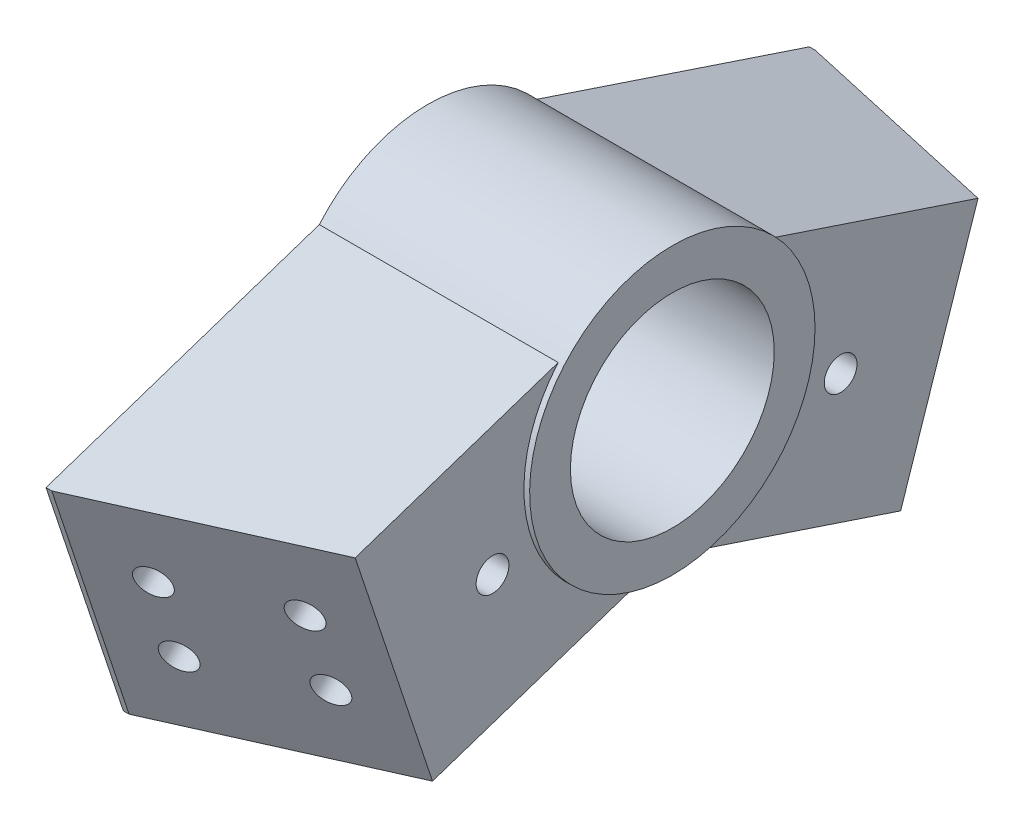
ISO-10303-21;
HEADER;
FILE_DESCRIPTION(('STEP AP214'),'2;1');
FILE_NAME('part.step','',(''),(''),'','','');
FILE_SCHEMA(('AUTOMOTIVE_DESIGN { 1 0 10303 214 1 1 1 1 }'));
ENDSEC;
DATA;
#1=APPLICATION_CONTEXT('core data for automotive mechanical design processes');
#2=APPLICATION_PROTOCOL_DEFINITION('international standard','automotive_design',2000,#1);
#3=PRODUCT_CONTEXT('',#1,'mechanical');
#4=PRODUCT('Part','Part','',(#3));
#5=PRODUCT_RELATED_PRODUCT_CATEGORY('part','',(#4));
#6=PRODUCT_DEFINITION_FORMATION('','',#4);
#7=PRODUCT_DEFINITION_CONTEXT('part definition',#1,'design');
#8=PRODUCT_DEFINITION('design','',#6,#7);
#9=PRODUCT_DEFINITION_SHAPE('','',#8);
#10=(LENGTH_UNIT() NAMED_UNIT(*) SI_UNIT(.MILLI.,.METRE.));
#11=(NAMED_UNIT(*) PLANE_ANGLE_UNIT() SI_UNIT($,.RADIAN.));
#12=(NAMED_UNIT(*) SI_UNIT($,.STERADIAN.) SOLID_ANGLE_UNIT());
#13=UNCERTAINTY_MEASURE_WITH_UNIT(LENGTH_MEASURE(1.E-05),#10,'distance_accuracy_value','');
#14=(GEOMETRIC_REPRESENTATION_CONTEXT(3) GLOBAL_UNCERTAINTY_ASSIGNED_CONTEXT((#13)) GLOBAL_UNIT_ASSIGNED_CONTEXT((#10,
#11,#12)) REPRESENTATION_CONTEXT('',''));
#15=CARTESIAN_POINT('',(0.,0.,0.));
#16=DIRECTION('',(0.,0.,1.));
#17=DIRECTION('',(1.,0.,0.));
#18=AXIS2_PLACEMENT_3D('',#15,#16,#17);
#19=CARTESIAN_POINT('',(101.6,-76.2,-228.6));
#20=DIRECTION('',(-1.,0.,0.));
#21=DIRECTION('',(0.,0.,1.));
#22=AXIS2_PLACEMENT_3D('',#19,#20,#21);
#23=CYLINDRICAL_SURFACE('',#22,22.225);
#24=CARTESIAN_POINT('',(101.6,-76.2,-228.6));
#25=DIRECTION('',(1.,0.,0.));
#26=DIRECTION('',(0.,0.,-1.));
#27=AXIS2_PLACEMENT_3D('',#24,#25,#26);
#28=CIRCLE('',#27,22.225);
#29=CARTESIAN_POINT('',(101.6,-76.2,-250.825));
#30=VERTEX_POINT('',#29);
#31=EDGE_CURVE('E11',#30,#30,#28,.T.);
#32=ORIENTED_EDGE('',*,*,#31,.F.);
#33=EDGE_LOOP('',(#32));
#34=FACE_BOUND('',#33,.T.);
#35=DIRECTION('',(-1.,0.,0.));
#36=VECTOR('',#35,1.);
#37=CARTESIAN_POINT('',(101.6,-61.7476401468381,-245.484309866699));
#38=LINE('',#37,#36);
#39=CARTESIAN_POINT('',(63.5,-61.7476401468266,-245.484309866712));
#40=VERTEX_POINT('',#39);
#41=CARTESIAN_POINT('',(100.70528765619,-61.747640146848,-245.484309866754));
#42=VERTEX_POINT('',#41);
#43=EDGE_CURVE('E171',#40,#42,#38,.F.);
#44=ORIENTED_EDGE('',*,*,#43,.F.);
#45=CARTESIAN_POINT('',(63.5,-76.2,-228.6));
#46=DIRECTION('',(1.,0.,0.));
#47=DIRECTION('',(0.,0.,-1.));
#48=AXIS2_PLACEMENT_3D('',#45,#46,#47);
#49=CIRCLE('',#48,22.225);
#50=CARTESIAN_POINT('',(63.5,-61.7476401469432,-211.715690133211));
#51=VERTEX_POINT('',#50);
#52=EDGE_CURVE('E54',#40,#51,#49,.T.);
#53=ORIENTED_EDGE('',*,*,#52,.T.);
#54=DIRECTION('',(-1.,0.,0.));
#55=VECTOR('',#54,1.);
#56=CARTESIAN_POINT('',(101.6,-61.74764014688,-211.715690133265));
#57=LINE('',#56,#55);
#58=CARTESIAN_POINT('',(100.70528765619,-61.74764014688,-211.715690133265));
#59=VERTEX_POINT('',#58);
#60=EDGE_CURVE('E213',#51,#59,#57,.F.);
#61=ORIENTED_EDGE('',*,*,#60,.T.);
#62=CARTESIAN_POINT('',(100.70528765619,-76.2,-228.6));
#63=DIRECTION('',(-1.,0.,0.));
#64=DIRECTION('',(0.,0.,1.));
#65=AXIS2_PLACEMENT_3D('',#62,#63,#64);
#66=CIRCLE('',#65,22.225);
#67=CARTESIAN_POINT('',(100.70528765619,-97.8924738025491,-223.763968018538));
#68=VERTEX_POINT('',#67);
#69=EDGE_CURVE('E212',#59,#68,#66,.F.);
#70=ORIENTED_EDGE('',*,*,#69,.T.);
#71=DIRECTION('',(-1.,0.,0.));
#72=VECTOR('',#71,1.);
#73=CARTESIAN_POINT('',(101.6,-97.8924738025491,-223.763968018538));
#74=LINE('',#73,#72);
#75=CARTESIAN_POINT('',(63.5,-97.8924738025491,-223.763968018538));
#76=VERTEX_POINT('',#75);
#77=EDGE_CURVE('E47',#68,#76,#74,.T.);
#78=ORIENTED_EDGE('',*,*,#77,.T.);
#79=CARTESIAN_POINT('',(63.5,-97.8924738025568,-233.436031981508));
#80=VERTEX_POINT('',#79);
#81=EDGE_CURVE('E36',#76,#80,#49,.T.);
#82=ORIENTED_EDGE('',*,*,#81,.T.);
#83=DIRECTION('',(-1.,0.,0.));
#84=VECTOR('',#83,1.);
#85=CARTESIAN_POINT('',(101.6,-97.8924738025491,-233.436031981462));
#86=LINE('',#85,#84);
#87=CARTESIAN_POINT('',(100.70528765619,-97.8924738025491,-233.436031981462));
#88=VERTEX_POINT('',#87);
#89=EDGE_CURVE('E167',#88,#80,#86,.T.);
#90=ORIENTED_EDGE('',*,*,#89,.F.);
#91=CARTESIAN_POINT('',(100.70528765619,-76.2,-228.6));
#92=DIRECTION('',(1.,0.,0.));
#93=DIRECTION('',(0.,0.,-1.));
#94=AXIS2_PLACEMENT_3D('',#91,#92,#93);
#95=CIRCLE('',#94,22.225);
#96=EDGE_CURVE('E168',#42,#88,#95,.F.);
#97=ORIENTED_EDGE('',*,*,#96,.F.);
#98=EDGE_LOOP('',(#44,#53,#61,#70,#78,#82,#90,#97));
#99=FACE_BOUND('',#98,.T.);
#100=ADVANCED_FACE('F33',(#34,#99),#23,.T.);
#101=CARTESIAN_POINT('',(101.6,-76.2,-228.6));
#102=DIRECTION('',(1.,0.,0.));
#103=DIRECTION('',(0.,0.,-1.));
#104=AXIS2_PLACEMENT_3D('',#101,#102,#103);
#105=PLANE('',#104);
#106=CARTESIAN_POINT('',(101.6,-76.2,-228.6));
#107=DIRECTION('',(1.,0.,0.));
#108=DIRECTION('',(0.,0.,-1.));
#109=AXIS2_PLACEMENT_3D('',#106,#107,#108);
#110=CIRCLE('',#109,15.875);
#111=CARTESIAN_POINT('',(101.6,-76.2,-244.475));
#112=VERTEX_POINT('',#111);
#113=EDGE_CURVE('E246',#112,#112,#110,.T.);
#114=ORIENTED_EDGE('',*,*,#113,.F.);
#115=EDGE_LOOP('',(#114));
#116=FACE_BOUND('',#115,.T.);
#117=ORIENTED_EDGE('',*,*,#31,.T.);
#118=EDGE_LOOP('',(#117));
#119=FACE_BOUND('',#118,.T.);
#120=ADVANCED_FACE('F312',(#116,#119),#105,.T.);
#121=CARTESIAN_POINT('',(63.5,-76.2,-228.6));
#122=DIRECTION('',(1.,0.,0.));
#123=DIRECTION('',(0.,0.,-1.));
#124=AXIS2_PLACEMENT_3D('',#121,#122,#123);
#125=PLANE('',#124);
#126=CARTESIAN_POINT('',(63.4999999999997,-85.2362084139313,-255.708625241793));
#127=DIRECTION('',(-1.,0.,0.));
#128=DIRECTION('',(0.,0.,1.));
#129=AXIS2_PLACEMENT_3D('',#126,#127,#128);
#130=CIRCLE('',#129,2.55269999999999);
#131=CARTESIAN_POINT('',(63.4999999999997,-85.2362084139313,-253.155925241793));
#132=VERTEX_POINT('',#131);
#133=EDGE_CURVE('E303',#132,#132,#130,.T.);
#134=ORIENTED_EDGE('',*,*,#133,.F.);
#135=EDGE_LOOP('',(#134));
#136=FACE_BOUND('',#135,.T.);
#137=CARTESIAN_POINT('',(63.4999999999997,-85.2362084139314,-201.491374758207));
#138=DIRECTION('',(-1.,0.,0.));
#139=DIRECTION('',(0.,0.,1.));
#140=AXIS2_PLACEMENT_3D('',#137,#138,#139);
#141=CIRCLE('',#140,2.55269999999999);
#142=CARTESIAN_POINT('',(63.4999999999997,-85.2362084139314,-198.938674758207));
#143=VERTEX_POINT('',#142);
#144=EDGE_CURVE('E297',#143,#143,#141,.T.);
#145=ORIENTED_EDGE('',*,*,#144,.F.);
#146=EDGE_LOOP('',(#145));
#147=FACE_BOUND('',#146,.T.);
#148=CARTESIAN_POINT('',(63.5,-76.2,-228.6));
#149=DIRECTION('',(1.,0.,0.));
#150=DIRECTION('',(0.,0.,-1.));
#151=AXIS2_PLACEMENT_3D('',#148,#149,#150);
#152=CIRCLE('',#151,15.875);
#153=CARTESIAN_POINT('',(63.5,-76.2,-244.475));
#154=VERTEX_POINT('',#153);
#155=EDGE_CURVE('E254',#154,#154,#152,.T.);
#156=ORIENTED_EDGE('',*,*,#155,.T.);
#157=EDGE_LOOP('',(#156));
#158=FACE_BOUND('',#157,.T.);
#159=ORIENTED_EDGE('',*,*,#81,.F.);
#160=DIRECTION('',(0.,0.316227766016993,-0.948683298050462));
#161=VECTOR('',#160,1.);
#162=CARTESIAN_POINT('',(63.5,-97.8924738025491,-223.763968018538));
#163=LINE('',#162,#161);
#164=CARTESIAN_POINT('',(63.5,-112.08120913018,-181.197762035668));
#165=VERTEX_POINT('',#164);
#166=EDGE_CURVE('E225',#165,#76,#163,.T.);
#167=ORIENTED_EDGE('',*,*,#166,.F.);
#168=DIRECTION('',(0.,-0.948683298050514,-0.316227766016838));
#169=VECTOR('',#168,1.);
#170=CARTESIAN_POINT('',(63.5,-112.08120913018,-181.197762035668));
#171=LINE('',#170,#169);
#172=CARTESIAN_POINT('',(63.5,-75.9363754744556,-169.149484150427));
#173=VERTEX_POINT('',#172);
#174=EDGE_CURVE('E240',#173,#165,#171,.T.);
#175=ORIENTED_EDGE('',*,*,#174,.F.);
#176=DIRECTION('',(0.,-0.316227766017049,0.948683298050444));
#177=VECTOR('',#176,1.);
#178=CARTESIAN_POINT('',(63.5,-75.9363754744557,-169.149484150426));
#179=LINE('',#178,#177);
#180=EDGE_CURVE('E236',#51,#173,#179,.T.);
#181=ORIENTED_EDGE('',*,*,#180,.F.);
#182=ORIENTED_EDGE('',*,*,#52,.F.);
#183=DIRECTION('',(0.,0.316227766016693,0.948683298050562));
#184=VECTOR('',#183,1.);
#185=CARTESIAN_POINT('',(63.5,-61.7476401468381,-245.484309866699));
#186=LINE('',#185,#184);
#187=CARTESIAN_POINT('',(63.5,-75.9363754744556,-288.050515849574));
#188=VERTEX_POINT('',#187);
#189=EDGE_CURVE('E250',#188,#40,#186,.T.);
#190=ORIENTED_EDGE('',*,*,#189,.F.);
#191=DIRECTION('',(0.,0.948683298050514,-0.316227766016838));
#192=VECTOR('',#191,1.);
#193=CARTESIAN_POINT('',(63.5,-75.9363754744557,-288.050515849574));
#194=LINE('',#193,#192);
#195=CARTESIAN_POINT('',(63.5,-112.08120913018,-276.002237964332));
#196=VERTEX_POINT('',#195);
#197=EDGE_CURVE('E139',#196,#188,#194,.T.);
#198=ORIENTED_EDGE('',*,*,#197,.F.);
#199=DIRECTION('',(0.,-0.31622776601683,-0.948683298050517));
#200=VECTOR('',#199,1.);
#201=CARTESIAN_POINT('',(63.5,-112.08120913018,-276.002237964332));
#202=LINE('',#201,#200);
#203=EDGE_CURVE('E291',#80,#196,#202,.T.);
#204=ORIENTED_EDGE('',*,*,#203,.F.);
#205=EDGE_LOOP('',(#159,#167,#175,#181,#182,#190,#198,#204));
#206=FACE_BOUND('',#205,.T.);
#207=ADVANCED_FACE('F309',(#136,#147,#158,#206),#125,.F.);
#208=CARTESIAN_POINT('',(100.705287655612,166534.347129812,-500000.));
#209=DIRECTION('',(-1.,0.,0.));
#210=DIRECTION('',(0.,0.,1.));
#211=AXIS2_PLACEMENT_3D('',#208,#209,#210);
#212=PLANE('',#211);
#213=CARTESIAN_POINT('',(100.70528765619,-85.2362084139314,-201.491374758207));
#214=DIRECTION('',(-1.,0.,0.));
#215=DIRECTION('',(0.,0.,1.));
#216=AXIS2_PLACEMENT_3D('',#213,#214,#215);
#217=CIRCLE('',#216,2.55269999999999);
#218=CARTESIAN_POINT('',(100.70528765619,-85.2362084139314,-198.938674758207));
#219=VERTEX_POINT('',#218);
#220=EDGE_CURVE('E144',#219,#219,#217,.T.);
#221=ORIENTED_EDGE('',*,*,#220,.T.);
#222=EDGE_LOOP('',(#221));
#223=FACE_BOUND('',#222,.T.);
#224=ORIENTED_EDGE('',*,*,#69,.F.);
#225=DIRECTION('',(0.,-0.316227766016844,0.948683298050512));
#226=VECTOR('',#225,1.);
#227=CARTESIAN_POINT('',(100.705287655612,166534.347129812,-500000.));
#228=LINE('',#227,#226);
#229=CARTESIAN_POINT('',(100.70528765619,-72.2873739605623,-180.096488692107));
#230=VERTEX_POINT('',#229);
#231=EDGE_CURVE('E201',#59,#230,#228,.T.);
#232=ORIENTED_EDGE('',*,*,#231,.T.);
#233=DIRECTION('',(0.,-0.948683298050514,-0.316227766016838));
#234=VECTOR('',#233,1.);
#235=CARTESIAN_POINT('',(100.70528765619,-72.2873739605623,-180.096488692107));
#236=LINE('',#235,#234);
#237=CARTESIAN_POINT('',(100.70528765619,-108.432207616287,-192.144766577348));
#238=VERTEX_POINT('',#237);
#239=EDGE_CURVE('E197',#230,#238,#236,.T.);
#240=ORIENTED_EDGE('',*,*,#239,.T.);
#241=DIRECTION('',(0.,-0.316227766016844,0.948683298050512));
#242=VECTOR('',#241,1.);
#243=CARTESIAN_POINT('',(100.705287655612,166498.202296156,-500012.048277885));
#244=LINE('',#243,#242);
#245=EDGE_CURVE('E210',#68,#238,#244,.T.);
#246=ORIENTED_EDGE('',*,*,#245,.F.);
#247=EDGE_LOOP('',(#224,#232,#240,#246));
#248=FACE_BOUND('',#247,.T.);
#249=ADVANCED_FACE('F226',(#223,#248),#212,.F.);
#250=CARTESIAN_POINT('',(64.3947123432313,166494.553294643,-500001.101273344));
#251=DIRECTION('',(0.,0.948683298050512,0.316227766016844));
#252=DIRECTION('',(0.,-0.316227766016844,0.948683298050512));
#253=AXIS2_PLACEMENT_3D('',#250,#251,#252);
#254=PLANE('',#253);
#255=ORIENTED_EDGE('',*,*,#77,.F.);
#256=ORIENTED_EDGE('',*,*,#245,.T.);
#257=DIRECTION('',(-0.953033472765887,-0.0957743179499562,0.28732295384987));
#258=VECTOR('',#257,1.);
#259=CARTESIAN_POINT('',(64.3947123438099,-112.08120913018,-181.197762035668));
#260=LINE('',#259,#258);
#261=CARTESIAN_POINT('',(64.3947123438099,-112.08120913018,-181.197762035668));
#262=VERTEX_POINT('',#261);
#263=EDGE_CURVE('E205',#238,#262,#260,.T.);
#264=ORIENTED_EDGE('',*,*,#263,.T.);
#265=DIRECTION('',(1.,0.,0.));
#266=VECTOR('',#265,1.);
#267=CARTESIAN_POINT('',(-10.7711923613539,-112.08120913018,-181.197762035668));
#268=LINE('',#267,#266);
#269=EDGE_CURVE('E233',#165,#262,#268,.T.);
#270=ORIENTED_EDGE('',*,*,#269,.F.);
#271=ORIENTED_EDGE('',*,*,#166,.T.);
#272=EDGE_LOOP('',(#255,#256,#264,#270,#271));
#273=FACE_BOUND('',#272,.T.);
#274=ADVANCED_FACE('F222',(#273),#254,.F.);
#275=CARTESIAN_POINT('',(64.3947123432313,166530.698128298,-499989.052995458));
#276=DIRECTION('',(0.,-0.948683298050512,-0.316227766016844));
#277=DIRECTION('',(0.,0.316227766016844,-0.948683298050512));
#278=AXIS2_PLACEMENT_3D('',#275,#276,#277);
#279=PLANE('',#278);
#280=ORIENTED_EDGE('',*,*,#60,.F.);
#281=ORIENTED_EDGE('',*,*,#180,.T.);
#282=DIRECTION('',(1.,0.,0.));
#283=VECTOR('',#282,1.);
#284=CARTESIAN_POINT('',(-10.7711923613539,-75.9363754744557,-169.149484150426));
#285=LINE('',#284,#283);
#286=CARTESIAN_POINT('',(64.3947123438099,-75.9363754744556,-169.149484150427));
#287=VERTEX_POINT('',#286);
#288=EDGE_CURVE('E237',#173,#287,#285,.T.);
#289=ORIENTED_EDGE('',*,*,#288,.T.);
#290=DIRECTION('',(0.953033472765887,0.0957743179499562,-0.28732295384987));
#291=VECTOR('',#290,1.);
#292=CARTESIAN_POINT('',(64.3947123438099,-75.9363754744556,-169.149484150427));
#293=LINE('',#292,#291);
#294=EDGE_CURVE('E198',#287,#230,#293,.T.);
#295=ORIENTED_EDGE('',*,*,#294,.T.);
#296=ORIENTED_EDGE('',*,*,#231,.F.);
#297=EDGE_LOOP('',(#280,#281,#289,#295,#296));
#298=FACE_BOUND('',#297,.T.);
#299=ADVANCED_FACE('F317',(#298),#279,.F.);
#300=CARTESIAN_POINT('',(-33.4800061517165,33.3153680589672,-99.9461041769018));
#301=DIRECTION('',(0.302864986071011,-0.301375646032025,0.904126938096076));
#302=DIRECTION('',(0.948213667692879,0.,-0.31763318529464));
#303=AXIS2_PLACEMENT_3D('',#300,#301,#302);
#304=PLANE('',#303);
#305=CARTESIAN_POINT('',(91.6276438280951,-85.2479022242772,-181.3758301851));
#306=DIRECTION('',(0.302864986071011,-0.301375646032025,0.904126938096076));
#307=DIRECTION('',(0.948213667692879,0.,-0.31763318529464));
#308=AXIS2_PLACEMENT_3D('',#305,#306,#307);
#309=CIRCLE('',#308,2.55269999999998);
#310=CARTESIAN_POINT('',(94.0481488576147,-85.2479022242772,-182.186652417202));
#311=VERTEX_POINT('',#310);
#312=EDGE_CURVE('E176',#311,#311,#309,.T.);
#313=ORIENTED_EDGE('',*,*,#312,.F.);
#314=EDGE_LOOP('',(#313));
#315=FACE_BOUND('',#314,.T.);
#316=CARTESIAN_POINT('',(91.6276438280951,-97.2961801095187,-185.391922813514));
#317=DIRECTION('',(0.302864986071011,-0.301375646032025,0.904126938096076));
#318=DIRECTION('',(0.948213667692879,0.,-0.31763318529464));
#319=AXIS2_PLACEMENT_3D('',#316,#317,#318);
#320=CIRCLE('',#319,2.55269999999998);
#321=CARTESIAN_POINT('',(94.0481488576147,-97.2961801095187,-186.202745045616));
#322=VERTEX_POINT('',#321);
#323=EDGE_CURVE('E182',#322,#322,#320,.T.);
#324=ORIENTED_EDGE('',*,*,#323,.F.);
#325=EDGE_LOOP('',(#324));
#326=FACE_BOUND('',#325,.T.);
#327=CARTESIAN_POINT('',(73.472356171905,-87.0724029812239,-175.90232791426));
#328=DIRECTION('',(0.302864986071011,-0.301375646032025,0.904126938096076));
#329=DIRECTION('',(0.948213667692879,0.,-0.31763318529464));
#330=AXIS2_PLACEMENT_3D('',#327,#328,#329);
#331=CIRCLE('',#330,2.55269999999998);
#332=CARTESIAN_POINT('',(75.8928612014246,-87.0724029812239,-176.713150146362));
#333=VERTEX_POINT('',#332);
#334=EDGE_CURVE('E188',#333,#333,#331,.T.);
#335=ORIENTED_EDGE('',*,*,#334,.F.);
#336=EDGE_LOOP('',(#335));
#337=FACE_BOUND('',#336,.T.);
#338=CARTESIAN_POINT('',(73.472356171905,-99.1206808664654,-179.918420542674));
#339=DIRECTION('',(0.302864986071011,-0.301375646032025,0.904126938096076));
#340=DIRECTION('',(0.948213667692879,0.,-0.31763318529464));
#341=AXIS2_PLACEMENT_3D('',#338,#339,#340);
#342=CIRCLE('',#341,2.55269999999998);
#343=CARTESIAN_POINT('',(75.8928612014246,-99.1206808664654,-180.729242774776));
#344=VERTEX_POINT('',#343);
#345=EDGE_CURVE('E194',#344,#344,#342,.T.);
#346=ORIENTED_EDGE('',*,*,#345,.F.);
#347=EDGE_LOOP('',(#346));
#348=FACE_BOUND('',#347,.T.);
#349=ORIENTED_EDGE('',*,*,#239,.F.);
#350=ORIENTED_EDGE('',*,*,#294,.F.);
#351=DIRECTION('',(0.,0.948683298050514,0.316227766016838));
#352=VECTOR('',#351,1.);
#353=CARTESIAN_POINT('',(64.3947123438099,-75.9363754744556,-169.149484150427));
#354=LINE('',#353,#352);
#355=EDGE_CURVE('E202',#262,#287,#354,.T.);
#356=ORIENTED_EDGE('',*,*,#355,.F.);
#357=ORIENTED_EDGE('',*,*,#263,.F.);
#358=EDGE_LOOP('',(#349,#350,#356,#357));
#359=FACE_BOUND('',#358,.T.);
#360=ADVANCED_FACE('F229',(#315,#326,#337,#348,#359),#304,.T.);
#361=CARTESIAN_POINT('',(73.472356171905,-99.1206808664654,-179.918420542674));
#362=DIRECTION('',(0.302864986071011,-0.301375646032025,0.904126938096076));
#363=DIRECTION('',(0.948213667692879,0.,-0.31763318529464));
#364=AXIS2_PLACEMENT_3D('',#361,#362,#363);
#365=CYLINDRICAL_SURFACE('',#364,2.55269999999999);
#366=CARTESIAN_POINT('',(70.3952479134236,-96.05870430278,-189.10435023373));
#367=DIRECTION('',(0.302864986071011,-0.301375646032025,0.904126938096076));
#368=DIRECTION('',(0.948213667692879,0.,-0.31763318529464));
#369=AXIS2_PLACEMENT_3D('',#366,#367,#368);
#370=CIRCLE('',#369,2.55269999999999);
#371=CARTESIAN_POINT('',(72.8157529429432,-96.05870430278,-189.915172465832));
#372=VERTEX_POINT('',#371);
#373=EDGE_CURVE('E191',#372,#372,#370,.T.);
#374=ORIENTED_EDGE('',*,*,#373,.F.);
#375=EDGE_LOOP('',(#374));
#376=FACE_BOUND('',#375,.T.);
#377=ORIENTED_EDGE('',*,*,#345,.T.);
#378=EDGE_LOOP('',(#377));
#379=FACE_BOUND('',#378,.T.);
#380=ADVANCED_FACE('F324',(#376,#379),#365,.F.);
#381=CARTESIAN_POINT('',(70.3952479134236,-96.05870430278,-189.10435023373));
#382=DIRECTION('',(0.302864986071011,-0.301375646032025,0.904126938096076));
#383=DIRECTION('',(0.948213667692879,0.,-0.31763318529464));
#384=AXIS2_PLACEMENT_3D('',#381,#382,#383);
#385=CONICAL_SURFACE('',#384,2.55269999999999,1.02974425867665);
#386=CARTESIAN_POINT('',(69.9307084787058,-95.5964492429872,-190.491115413109));
#387=VERTEX_POINT('',#386);
#388=VERTEX_LOOP('',#387);
#389=FACE_BOUND('',#388,.T.);
#390=ORIENTED_EDGE('',*,*,#373,.T.);
#391=EDGE_LOOP('',(#390));
#392=FACE_BOUND('',#391,.T.);
#393=ADVANCED_FACE('F346',(#389,#392),#385,.F.);
#394=CARTESIAN_POINT('',(73.472356171905,-87.0724029812239,-175.90232791426));
#395=DIRECTION('',(0.302864986071011,-0.301375646032025,0.904126938096076));
#396=DIRECTION('',(0.948213667692879,0.,-0.31763318529464));
#397=AXIS2_PLACEMENT_3D('',#394,#395,#396);
#398=CYLINDRICAL_SURFACE('',#397,2.55269999999999);
#399=CARTESIAN_POINT('',(70.3952479134236,-84.0104264175385,-185.088257605316));
#400=DIRECTION('',(0.302864986071011,-0.301375646032025,0.904126938096076));
#401=DIRECTION('',(0.948213667692879,0.,-0.31763318529464));
#402=AXIS2_PLACEMENT_3D('',#399,#400,#401);
#403=CIRCLE('',#402,2.55269999999999);
#404=CARTESIAN_POINT('',(72.8157529429432,-84.0104264175385,-185.899079837418));
#405=VERTEX_POINT('',#404);
#406=EDGE_CURVE('E185',#405,#405,#403,.T.);
#407=ORIENTED_EDGE('',*,*,#406,.F.);
#408=EDGE_LOOP('',(#407));
#409=FACE_BOUND('',#408,.T.);
#410=ORIENTED_EDGE('',*,*,#334,.T.);
#411=EDGE_LOOP('',(#410));
#412=FACE_BOUND('',#411,.T.);
#413=ADVANCED_FACE('F352',(#409,#412),#398,.F.);
#414=CARTESIAN_POINT('',(70.3952479134236,-84.0104264175385,-185.088257605316));
#415=DIRECTION('',(0.302864986071011,-0.301375646032025,0.904126938096076));
#416=DIRECTION('',(0.948213667692879,0.,-0.31763318529464));
#417=AXIS2_PLACEMENT_3D('',#414,#415,#416);
#418=CONICAL_SURFACE('',#417,2.55269999999999,1.02974425867665);
#419=CARTESIAN_POINT('',(69.9307084787058,-83.5481713577457,-186.475022784695));
#420=VERTEX_POINT('',#419);
#421=VERTEX_LOOP('',#420);
#422=FACE_BOUND('',#421,.T.);
#423=ORIENTED_EDGE('',*,*,#406,.T.);
#424=EDGE_LOOP('',(#423));
#425=FACE_BOUND('',#424,.T.);
#426=ADVANCED_FACE('F360',(#422,#425),#418,.F.);
#427=CARTESIAN_POINT('',(91.6276438280951,-97.2961801095187,-185.391922813514));
#428=DIRECTION('',(0.302864986071011,-0.301375646032025,0.904126938096076));
#429=DIRECTION('',(0.948213667692879,0.,-0.31763318529464));
#430=AXIS2_PLACEMENT_3D('',#427,#428,#429);
#431=CYLINDRICAL_SURFACE('',#430,2.55269999999999);
#432=CARTESIAN_POINT('',(88.5505355696137,-94.2342035458334,-194.57785250457));
#433=DIRECTION('',(0.302864986071011,-0.301375646032025,0.904126938096076));
#434=DIRECTION('',(0.948213667692879,0.,-0.31763318529464));
#435=AXIS2_PLACEMENT_3D('',#432,#433,#434);
#436=CIRCLE('',#435,2.55269999999999);
#437=CARTESIAN_POINT('',(90.9710405991333,-94.2342035458334,-195.388674736672));
#438=VERTEX_POINT('',#437);
#439=EDGE_CURVE('E179',#438,#438,#436,.T.);
#440=ORIENTED_EDGE('',*,*,#439,.F.);
#441=EDGE_LOOP('',(#440));
#442=FACE_BOUND('',#441,.T.);
#443=ORIENTED_EDGE('',*,*,#323,.T.);
#444=EDGE_LOOP('',(#443));
#445=FACE_BOUND('',#444,.T.);
#446=ADVANCED_FACE('F364',(#442,#445),#431,.F.);
#447=CARTESIAN_POINT('',(88.5505355696137,-94.2342035458334,-194.57785250457));
#448=DIRECTION('',(0.302864986071011,-0.301375646032025,0.904126938096076));
#449=DIRECTION('',(0.948213667692879,0.,-0.31763318529464));
#450=AXIS2_PLACEMENT_3D('',#447,#448,#449);
#451=CONICAL_SURFACE('',#450,2.55269999999999,1.02974425867665);
#452=CARTESIAN_POINT('',(88.0859961348959,-93.7719484860405,-195.964617683949));
#453=VERTEX_POINT('',#452);
#454=VERTEX_LOOP('',#453);
#455=FACE_BOUND('',#454,.T.);
#456=ORIENTED_EDGE('',*,*,#439,.T.);
#457=EDGE_LOOP('',(#456));
#458=FACE_BOUND('',#457,.T.);
#459=ADVANCED_FACE('F368',(#455,#458),#451,.F.);
#460=CARTESIAN_POINT('',(91.6276438280951,-85.2479022242772,-181.3758301851));
#461=DIRECTION('',(0.302864986071011,-0.301375646032025,0.904126938096076));
#462=DIRECTION('',(0.948213667692879,0.,-0.31763318529464));
#463=AXIS2_PLACEMENT_3D('',#460,#461,#462);
#464=CYLINDRICAL_SURFACE('',#463,2.55269999999999);
#465=CARTESIAN_POINT('',(88.5505355696137,-82.1859256605918,-190.561759876157));
#466=DIRECTION('',(0.302864986071011,-0.301375646032025,0.904126938096076));
#467=DIRECTION('',(0.948213667692879,0.,-0.31763318529464));
#468=AXIS2_PLACEMENT_3D('',#465,#466,#467);
#469=CIRCLE('',#468,2.55269999999999);
#470=CARTESIAN_POINT('',(90.9710405991333,-82.1859256605918,-191.372582108258));
#471=VERTEX_POINT('',#470);
#472=EDGE_CURVE('E173',#471,#471,#469,.T.);
#473=ORIENTED_EDGE('',*,*,#472,.F.);
#474=EDGE_LOOP('',(#473));
#475=FACE_BOUND('',#474,.T.);
#476=ORIENTED_EDGE('',*,*,#312,.T.);
#477=EDGE_LOOP('',(#476));
#478=FACE_BOUND('',#477,.T.);
#479=ADVANCED_FACE('F372',(#475,#478),#464,.F.);
#480=CARTESIAN_POINT('',(88.5505355696137,-82.1859256605918,-190.561759876157));
#481=DIRECTION('',(0.302864986071011,-0.301375646032025,0.904126938096076));
#482=DIRECTION('',(0.948213667692879,0.,-0.31763318529464));
#483=AXIS2_PLACEMENT_3D('',#480,#481,#482);
#484=CONICAL_SURFACE('',#483,2.55269999999999,1.02974425867665);
#485=CARTESIAN_POINT('',(88.0859961348959,-81.723670600799,-191.948525055535));
#486=VERTEX_POINT('',#485);
#487=VERTEX_LOOP('',#486);
#488=FACE_BOUND('',#487,.T.);
#489=ORIENTED_EDGE('',*,*,#472,.T.);
#490=EDGE_LOOP('',(#489));
#491=FACE_BOUND('',#490,.T.);
#492=ADVANCED_FACE('F376',(#488,#491),#484,.F.);
#493=CARTESIAN_POINT('',(64.3947123432308,166683.098128298,499989.052995458));
#494=DIRECTION('',(0.,0.948683298050512,-0.316227766016844));
#495=DIRECTION('',(0.,0.316227766016844,0.948683298050512));
#496=AXIS2_PLACEMENT_3D('',#493,#494,#495);
#497=PLANE('',#496);
#498=DIRECTION('',(0.953033472765887,0.0957743179499562,0.28732295384987));
#499=VECTOR('',#498,1.);
#500=CARTESIAN_POINT('',(64.3947123438099,-75.9363754744556,-288.050515849574));
#501=LINE('',#500,#499);
#502=CARTESIAN_POINT('',(64.3947123438098,-75.9363754744556,-288.050515849574));
#503=VERTEX_POINT('',#502);
#504=CARTESIAN_POINT('',(100.70528765619,-72.2873739605623,-277.103511307893));
#505=VERTEX_POINT('',#504);
#506=EDGE_CURVE('E151',#503,#505,#501,.T.);
#507=ORIENTED_EDGE('',*,*,#506,.F.);
#508=DIRECTION('',(1.,0.,0.));
#509=VECTOR('',#508,1.);
#510=CARTESIAN_POINT('',(-10.771192361354,-75.9363754744557,-288.050515849573));
#511=LINE('',#510,#509);
#512=EDGE_CURVE('E133',#188,#503,#511,.T.);
#513=ORIENTED_EDGE('',*,*,#512,.F.);
#514=ORIENTED_EDGE('',*,*,#189,.T.);
#515=ORIENTED_EDGE('',*,*,#43,.T.);
#516=DIRECTION('',(0.,-0.316227766016844,-0.948683298050512));
#517=VECTOR('',#516,1.);
#518=CARTESIAN_POINT('',(100.705287655611,166686.747129812,500000.));
#519=LINE('',#518,#517);
#520=EDGE_CURVE('E157',#42,#505,#519,.T.);
#521=ORIENTED_EDGE('',*,*,#520,.T.);
#522=EDGE_LOOP('',(#507,#513,#514,#515,#521));
#523=FACE_BOUND('',#522,.T.);
#524=ADVANCED_FACE('F155',(#523),#497,.T.);
#525=CARTESIAN_POINT('',(-33.4800061517165,33.3153680589672,-357.253895823098));
#526=DIRECTION('',(0.302864986071011,-0.301375646032025,-0.904126938096076));
#527=DIRECTION('',(0.948213667692879,0.,0.31763318529464));
#528=AXIS2_PLACEMENT_3D('',#525,#526,#527);
#529=PLANE('',#528);
#530=CARTESIAN_POINT('',(91.6276438280951,-85.2479022242772,-275.8241698149));
#531=DIRECTION('',(0.302864986071011,-0.301375646032025,-0.904126938096076));
#532=DIRECTION('',(-0.948213667692879,0.,-0.31763318529464));
#533=AXIS2_PLACEMENT_3D('',#530,#531,#532);
#534=CIRCLE('',#533,2.55269999999998);
#535=CARTESIAN_POINT('',(89.2071387985755,-85.2479022242772,-276.634992047001));
#536=VERTEX_POINT('',#535);
#537=EDGE_CURVE('E257',#536,#536,#534,.T.);
#538=ORIENTED_EDGE('',*,*,#537,.F.);
#539=EDGE_LOOP('',(#538));
#540=FACE_BOUND('',#539,.T.);
#541=CARTESIAN_POINT('',(91.6276438280951,-97.2961801095187,-271.808077186486));
#542=DIRECTION('',(0.302864986071011,-0.301375646032025,-0.904126938096076));
#543=DIRECTION('',(-0.948213667692879,0.,-0.31763318529464));
#544=AXIS2_PLACEMENT_3D('',#541,#542,#543);
#545=CIRCLE('',#544,2.55269999999998);
#546=CARTESIAN_POINT('',(89.2071387985755,-97.2961801095187,-272.618899418587));
#547=VERTEX_POINT('',#546);
#548=EDGE_CURVE('E265',#547,#547,#545,.T.);
#549=ORIENTED_EDGE('',*,*,#548,.F.);
#550=EDGE_LOOP('',(#549));
#551=FACE_BOUND('',#550,.T.);
#552=CARTESIAN_POINT('',(73.472356171905,-87.0724029812239,-281.29767208574));
#553=DIRECTION('',(0.302864986071011,-0.301375646032025,-0.904126938096076));
#554=DIRECTION('',(-0.948213667692879,0.,-0.31763318529464));
#555=AXIS2_PLACEMENT_3D('',#552,#553,#554);
#556=CIRCLE('',#555,2.55269999999998);
#557=CARTESIAN_POINT('',(71.0518511423854,-87.0724029812239,-282.108494317841));
#558=VERTEX_POINT('',#557);
#559=EDGE_CURVE('E271',#558,#558,#556,.T.);
#560=ORIENTED_EDGE('',*,*,#559,.F.);
#561=EDGE_LOOP('',(#560));
#562=FACE_BOUND('',#561,.T.);
#563=CARTESIAN_POINT('',(73.472356171905,-99.1206808664654,-277.281579457326));
#564=DIRECTION('',(0.302864986071011,-0.301375646032025,-0.904126938096076));
#565=DIRECTION('',(-0.948213667692879,0.,-0.31763318529464));
#566=AXIS2_PLACEMENT_3D('',#563,#564,#565);
#567=CIRCLE('',#566,2.55269999999998);
#568=CARTESIAN_POINT('',(71.0518511423854,-99.1206808664654,-278.092401689427));
#569=VERTEX_POINT('',#568);
#570=EDGE_CURVE('E277',#569,#569,#567,.T.);
#571=ORIENTED_EDGE('',*,*,#570,.F.);
#572=EDGE_LOOP('',(#571));
#573=FACE_BOUND('',#572,.T.);
#574=DIRECTION('',(0.,-0.948683298050514,0.316227766016838));
#575=VECTOR('',#574,1.);
#576=CARTESIAN_POINT('',(100.70528765619,-72.2873739605623,-277.103511307893));
#577=LINE('',#576,#575);
#578=CARTESIAN_POINT('',(100.70528765619,-108.432207616287,-265.055233422652));
#579=VERTEX_POINT('',#578);
#580=EDGE_CURVE('E163',#505,#579,#577,.T.);
#581=ORIENTED_EDGE('',*,*,#580,.T.);
#582=DIRECTION('',(-0.953033472765887,-0.0957743179499562,-0.28732295384987));
#583=VECTOR('',#582,1.);
#584=CARTESIAN_POINT('',(64.3947123438099,-112.08120913018,-276.002237964332));
#585=LINE('',#584,#583);
#586=CARTESIAN_POINT('',(64.3947123438099,-112.08120913018,-276.002237964332));
#587=VERTEX_POINT('',#586);
#588=EDGE_CURVE('E153',#579,#587,#585,.T.);
#589=ORIENTED_EDGE('',*,*,#588,.T.);
#590=DIRECTION('',(0.,0.948683298050514,-0.316227766016838));
#591=VECTOR('',#590,1.);
#592=CARTESIAN_POINT('',(64.3947123438099,-75.9363754744556,-288.050515849574));
#593=LINE('',#592,#591);
#594=EDGE_CURVE('E137',#587,#503,#593,.T.);
#595=ORIENTED_EDGE('',*,*,#594,.T.);
#596=ORIENTED_EDGE('',*,*,#506,.T.);
#597=EDGE_LOOP('',(#581,#589,#595,#596));
#598=FACE_BOUND('',#597,.T.);
#599=ADVANCED_FACE('F150',(#540,#551,#562,#573,#598),#529,.T.);
#600=CARTESIAN_POINT('',(100.705287655611,166686.747129812,500000.));
#601=DIRECTION('',(1.,0.,0.));
#602=DIRECTION('',(0.,0.,-1.));
#603=AXIS2_PLACEMENT_3D('',#600,#601,#602);
#604=PLANE('',#603);
#605=CARTESIAN_POINT('',(100.70528765619,-85.2362084139313,-255.708625241793));
#606=DIRECTION('',(1.,0.,0.));
#607=DIRECTION('',(0.,0.,-1.));
#608=AXIS2_PLACEMENT_3D('',#605,#606,#607);
#609=CIRCLE('',#608,2.55269999999999);
#610=CARTESIAN_POINT('',(100.70528765619,-85.2362084139313,-258.261325241793));
#611=VERTEX_POINT('',#610);
#612=EDGE_CURVE('E300',#611,#611,#609,.T.);
#613=ORIENTED_EDGE('',*,*,#612,.F.);
#614=EDGE_LOOP('',(#613));
#615=FACE_BOUND('',#614,.T.);
#616=ORIENTED_EDGE('',*,*,#520,.F.);
#617=ORIENTED_EDGE('',*,*,#96,.T.);
#618=DIRECTION('',(0.,-0.316227766016844,-0.948683298050512));
#619=VECTOR('',#618,1.);
#620=CARTESIAN_POINT('',(100.705287655611,166650.602296156,500012.048277885));
#621=LINE('',#620,#619);
#622=EDGE_CURVE('E159',#88,#579,#621,.T.);
#623=ORIENTED_EDGE('',*,*,#622,.T.);
#624=ORIENTED_EDGE('',*,*,#580,.F.);
#625=EDGE_LOOP('',(#616,#617,#623,#624));
#626=FACE_BOUND('',#625,.T.);
#627=ADVANCED_FACE('F284',(#615,#626),#604,.T.);
#628=CARTESIAN_POINT('',(64.3947123432308,166646.953294643,500001.101273344));
#629=DIRECTION('',(0.,-0.948683298050512,0.316227766016844));
#630=DIRECTION('',(0.,-0.316227766016844,-0.948683298050512));
#631=AXIS2_PLACEMENT_3D('',#628,#629,#630);
#632=PLANE('',#631);
#633=ORIENTED_EDGE('',*,*,#622,.F.);
#634=ORIENTED_EDGE('',*,*,#89,.T.);
#635=ORIENTED_EDGE('',*,*,#203,.T.);
#636=DIRECTION('',(1.,0.,0.));
#637=VECTOR('',#636,1.);
#638=CARTESIAN_POINT('',(-10.771192361354,-112.08120913018,-276.002237964332));
#639=LINE('',#638,#637);
#640=EDGE_CURVE('E143',#196,#587,#639,.T.);
#641=ORIENTED_EDGE('',*,*,#640,.T.);
#642=ORIENTED_EDGE('',*,*,#588,.F.);
#643=EDGE_LOOP('',(#633,#634,#635,#641,#642));
#644=FACE_BOUND('',#643,.T.);
#645=ADVANCED_FACE('F288',(#644),#632,.T.);
#646=CARTESIAN_POINT('',(70.3952479134236,-96.05870430278,-268.09564976627));
#647=DIRECTION('',(0.302864986071011,-0.301375646032025,-0.904126938096076));
#648=DIRECTION('',(-0.948213667692879,0.,-0.31763318529464));
#649=AXIS2_PLACEMENT_3D('',#646,#647,#648);
#650=CONICAL_SURFACE('',#649,2.55269999999999,1.02974425867666);
#651=CARTESIAN_POINT('',(69.9307084787058,-95.5964492429872,-266.708884586891));
#652=VERTEX_POINT('',#651);
#653=VERTEX_LOOP('',#652);
#654=FACE_BOUND('',#653,.T.);
#655=CARTESIAN_POINT('',(70.3952479134236,-96.05870430278,-268.09564976627));
#656=DIRECTION('',(0.302864986071011,-0.301375646032025,-0.904126938096076));
#657=DIRECTION('',(-0.948213667692879,0.,-0.31763318529464));
#658=AXIS2_PLACEMENT_3D('',#655,#656,#657);
#659=CIRCLE('',#658,2.55269999999999);
#660=CARTESIAN_POINT('',(67.9747428839039,-96.05870430278,-268.906471998371));
#661=VERTEX_POINT('',#660);
#662=EDGE_CURVE('E172',#661,#661,#659,.T.);
#663=ORIENTED_EDGE('',*,*,#662,.T.);
#664=EDGE_LOOP('',(#663));
#665=FACE_BOUND('',#664,.T.);
#666=ADVANCED_FACE('F383',(#654,#665),#650,.F.);
#667=CARTESIAN_POINT('',(73.472356171905,-99.1206808664654,-277.281579457326));
#668=DIRECTION('',(0.302864986071011,-0.301375646032025,-0.904126938096076));
#669=DIRECTION('',(-0.948213667692879,0.,-0.31763318529464));
#670=AXIS2_PLACEMENT_3D('',#667,#668,#669);
#671=CYLINDRICAL_SURFACE('',#670,2.55269999999999);
#672=ORIENTED_EDGE('',*,*,#662,.F.);
#673=EDGE_LOOP('',(#672));
#674=FACE_BOUND('',#673,.T.);
#675=ORIENTED_EDGE('',*,*,#570,.T.);
#676=EDGE_LOOP('',(#675));
#677=FACE_BOUND('',#676,.T.);
#678=ADVANCED_FACE('F394',(#674,#677),#671,.F.);
#679=CARTESIAN_POINT('',(70.3952479134236,-84.0104264175385,-272.111742394684));
#680=DIRECTION('',(0.302864986071011,-0.301375646032025,-0.904126938096076));
#681=DIRECTION('',(-0.948213667692879,0.,-0.31763318529464));
#682=AXIS2_PLACEMENT_3D('',#679,#680,#681);
#683=CONICAL_SURFACE('',#682,2.55269999999999,1.02974425867666);
#684=CARTESIAN_POINT('',(69.9307084787058,-83.5481713577457,-270.724977215305));
#685=VERTEX_POINT('',#684);
#686=VERTEX_LOOP('',#685);
#687=FACE_BOUND('',#686,.T.);
#688=CARTESIAN_POINT('',(70.3952479134236,-84.0104264175385,-272.111742394684));
#689=DIRECTION('',(0.302864986071011,-0.301375646032025,-0.904126938096076));
#690=DIRECTION('',(-0.948213667692879,0.,-0.31763318529464));
#691=AXIS2_PLACEMENT_3D('',#688,#689,#690);
#692=CIRCLE('',#691,2.55269999999999);
#693=CARTESIAN_POINT('',(67.9747428839039,-84.0104264175385,-272.922564626785));
#694=VERTEX_POINT('',#693);
#695=EDGE_CURVE('E274',#694,#694,#692,.T.);
#696=ORIENTED_EDGE('',*,*,#695,.T.);
#697=EDGE_LOOP('',(#696));
#698=FACE_BOUND('',#697,.T.);
#699=ADVANCED_FACE('F398',(#687,#698),#683,.F.);
#700=CARTESIAN_POINT('',(73.472356171905,-87.0724029812239,-281.29767208574));
#701=DIRECTION('',(0.302864986071011,-0.301375646032025,-0.904126938096076));
#702=DIRECTION('',(-0.948213667692879,0.,-0.31763318529464));
#703=AXIS2_PLACEMENT_3D('',#700,#701,#702);
#704=CYLINDRICAL_SURFACE('',#703,2.55269999999999);
#705=ORIENTED_EDGE('',*,*,#695,.F.);
#706=EDGE_LOOP('',(#705));
#707=FACE_BOUND('',#706,.T.);
#708=ORIENTED_EDGE('',*,*,#559,.T.);
#709=EDGE_LOOP('',(#708));
#710=FACE_BOUND('',#709,.T.);
#711=ADVANCED_FACE('F402',(#707,#710),#704,.F.);
#712=CARTESIAN_POINT('',(88.5505355696137,-94.2342035458334,-262.62214749543));
#713=DIRECTION('',(0.302864986071011,-0.301375646032025,-0.904126938096076));
#714=DIRECTION('',(-0.948213667692879,0.,-0.31763318529464));
#715=AXIS2_PLACEMENT_3D('',#712,#713,#714);
#716=CONICAL_SURFACE('',#715,2.55269999999999,1.02974425867666);
#717=CARTESIAN_POINT('',(88.0859961348959,-93.7719484860405,-261.235382316051));
#718=VERTEX_POINT('',#717);
#719=VERTEX_LOOP('',#718);
#720=FACE_BOUND('',#719,.T.);
#721=CARTESIAN_POINT('',(88.5505355696137,-94.2342035458334,-262.62214749543));
#722=DIRECTION('',(0.302864986071011,-0.301375646032025,-0.904126938096076));
#723=DIRECTION('',(-0.948213667692879,0.,-0.31763318529464));
#724=AXIS2_PLACEMENT_3D('',#721,#722,#723);
#725=CIRCLE('',#724,2.55269999999999);
#726=CARTESIAN_POINT('',(86.1300305400941,-94.2342035458334,-263.432969727531));
#727=VERTEX_POINT('',#726);
#728=EDGE_CURVE('E268',#727,#727,#725,.T.);
#729=ORIENTED_EDGE('',*,*,#728,.T.);
#730=EDGE_LOOP('',(#729));
#731=FACE_BOUND('',#730,.T.);
#732=ADVANCED_FACE('F406',(#720,#731),#716,.F.);
#733=CARTESIAN_POINT('',(91.6276438280951,-97.2961801095187,-271.808077186486));
#734=DIRECTION('',(0.302864986071011,-0.301375646032025,-0.904126938096076));
#735=DIRECTION('',(-0.948213667692879,0.,-0.31763318529464));
#736=AXIS2_PLACEMENT_3D('',#733,#734,#735);
#737=CYLINDRICAL_SURFACE('',#736,2.55269999999999);
#738=ORIENTED_EDGE('',*,*,#728,.F.);
#739=EDGE_LOOP('',(#738));
#740=FACE_BOUND('',#739,.T.);
#741=ORIENTED_EDGE('',*,*,#548,.T.);
#742=EDGE_LOOP('',(#741));
#743=FACE_BOUND('',#742,.T.);
#744=ADVANCED_FACE('F410',(#740,#743),#737,.F.);
#745=CARTESIAN_POINT('',(88.5505355696137,-82.1859256605918,-266.638240123843));
#746=DIRECTION('',(0.302864986071011,-0.301375646032025,-0.904126938096076));
#747=DIRECTION('',(-0.948213667692879,0.,-0.31763318529464));
#748=AXIS2_PLACEMENT_3D('',#745,#746,#747);
#749=CONICAL_SURFACE('',#748,2.55269999999999,1.02974425867666);
#750=CARTESIAN_POINT('',(88.0859961348959,-81.723670600799,-265.251474944465));
#751=VERTEX_POINT('',#750);
#752=VERTEX_LOOP('',#751);
#753=FACE_BOUND('',#752,.T.);
#754=CARTESIAN_POINT('',(88.5505355696137,-82.1859256605918,-266.638240123843));
#755=DIRECTION('',(0.302864986071011,-0.301375646032025,-0.904126938096076));
#756=DIRECTION('',(-0.948213667692879,0.,-0.31763318529464));
#757=AXIS2_PLACEMENT_3D('',#754,#755,#756);
#758=CIRCLE('',#757,2.55269999999999);
#759=CARTESIAN_POINT('',(86.1300305400941,-82.1859256605918,-267.449062355945));
#760=VERTEX_POINT('',#759);
#761=EDGE_CURVE('E262',#760,#760,#758,.T.);
#762=ORIENTED_EDGE('',*,*,#761,.T.);
#763=EDGE_LOOP('',(#762));
#764=FACE_BOUND('',#763,.T.);
#765=ADVANCED_FACE('F414',(#753,#764),#749,.F.);
#766=CARTESIAN_POINT('',(91.6276438280951,-85.2479022242772,-275.8241698149));
#767=DIRECTION('',(0.302864986071011,-0.301375646032025,-0.904126938096076));
#768=DIRECTION('',(-0.948213667692879,0.,-0.31763318529464));
#769=AXIS2_PLACEMENT_3D('',#766,#767,#768);
#770=CYLINDRICAL_SURFACE('',#769,2.55269999999999);
#771=ORIENTED_EDGE('',*,*,#761,.F.);
#772=EDGE_LOOP('',(#771));
#773=FACE_BOUND('',#772,.T.);
#774=ORIENTED_EDGE('',*,*,#537,.T.);
#775=EDGE_LOOP('',(#774));
#776=FACE_BOUND('',#775,.T.);
#777=ADVANCED_FACE('F418',(#773,#776),#770,.F.);
#778=CARTESIAN_POINT('',(63.5,-76.2,-228.6));
#779=DIRECTION('',(1.,0.,0.));
#780=DIRECTION('',(0.,0.,-1.));
#781=AXIS2_PLACEMENT_3D('',#778,#779,#780);
#782=CYLINDRICAL_SURFACE('',#781,15.875);
#783=ORIENTED_EDGE('',*,*,#155,.F.);
#784=EDGE_LOOP('',(#783));
#785=FACE_BOUND('',#784,.T.);
#786=ORIENTED_EDGE('',*,*,#113,.T.);
#787=EDGE_LOOP('',(#786));
#788=FACE_BOUND('',#787,.T.);
#789=ADVANCED_FACE('F422',(#785,#788),#782,.F.);
#790=CARTESIAN_POINT('',(-10.7711923613539,-112.08120913018,-181.197762035668));
#791=DIRECTION('',(0.,0.316227766016838,-0.948683298050514));
#792=DIRECTION('',(0.,0.948683298050514,0.316227766016838));
#793=AXIS2_PLACEMENT_3D('',#790,#791,#792);
#794=PLANE('',#793);
#795=ORIENTED_EDGE('',*,*,#288,.F.);
#796=ORIENTED_EDGE('',*,*,#174,.T.);
#797=ORIENTED_EDGE('',*,*,#269,.T.);
#798=ORIENTED_EDGE('',*,*,#355,.T.);
#799=EDGE_LOOP('',(#795,#796,#797,#798));
#800=FACE_BOUND('',#799,.T.);
#801=ADVANCED_FACE('F241',(#800),#794,.F.);
#802=CARTESIAN_POINT('',(-10.771192361354,-75.9363754744557,-288.050515849573));
#803=DIRECTION('',(0.,0.316227766016838,0.948683298050514));
#804=DIRECTION('',(0.,-0.948683298050514,0.316227766016838));
#805=AXIS2_PLACEMENT_3D('',#802,#803,#804);
#806=PLANE('',#805);
#807=ORIENTED_EDGE('',*,*,#640,.F.);
#808=ORIENTED_EDGE('',*,*,#197,.T.);
#809=ORIENTED_EDGE('',*,*,#512,.T.);
#810=ORIENTED_EDGE('',*,*,#594,.F.);
#811=EDGE_LOOP('',(#807,#808,#809,#810));
#812=FACE_BOUND('',#811,.T.);
#813=ADVANCED_FACE('F136',(#812),#806,.F.);
#814=CARTESIAN_POINT('',(63.4999999999997,-85.2362084139314,-201.491374758207));
#815=DIRECTION('',(-1.,0.,0.));
#816=DIRECTION('',(0.,0.,1.));
#817=AXIS2_PLACEMENT_3D('',#814,#815,#816);
#818=CYLINDRICAL_SURFACE('',#817,2.55269999999999);
#819=ORIENTED_EDGE('',*,*,#144,.T.);
#820=EDGE_LOOP('',(#819));
#821=FACE_BOUND('',#820,.T.);
#822=ORIENTED_EDGE('',*,*,#220,.F.);
#823=EDGE_LOOP('',(#822));
#824=FACE_BOUND('',#823,.T.);
#825=ADVANCED_FACE('F431',(#821,#824),#818,.F.);
#826=CARTESIAN_POINT('',(63.4999999999997,-85.2362084139313,-255.708625241793));
#827=DIRECTION('',(-1.,0.,0.));
#828=DIRECTION('',(0.,0.,1.));
#829=AXIS2_PLACEMENT_3D('',#826,#827,#828);
#830=CYLINDRICAL_SURFACE('',#829,2.55269999999999);
#831=ORIENTED_EDGE('',*,*,#612,.T.);
#832=EDGE_LOOP('',(#831));
#833=FACE_BOUND('',#832,.T.);
#834=ORIENTED_EDGE('',*,*,#133,.T.);
#835=EDGE_LOOP('',(#834));
#836=FACE_BOUND('',#835,.T.);
#837=ADVANCED_FACE('F307',(#833,#836),#830,.F.);
#838=CLOSED_SHELL('',(#100,#120,#207,#249,#274,#299,#360,#380,#393,#413,#426,#446,#459,#479,
#492,#524,#599,#627,#645,#666,#678,#699,#711,#732,#744,#765,#777,#789,#801,#813,#825,#837));
#839=MANIFOLD_SOLID_BREP('B2',#838);
#840=ADVANCED_BREP_SHAPE_REPRESENTATION('',(#18,#839),#14);
#841=SHAPE_DEFINITION_REPRESENTATION(#9,#840);
ENDSEC;
END-ISO-10303-21;
